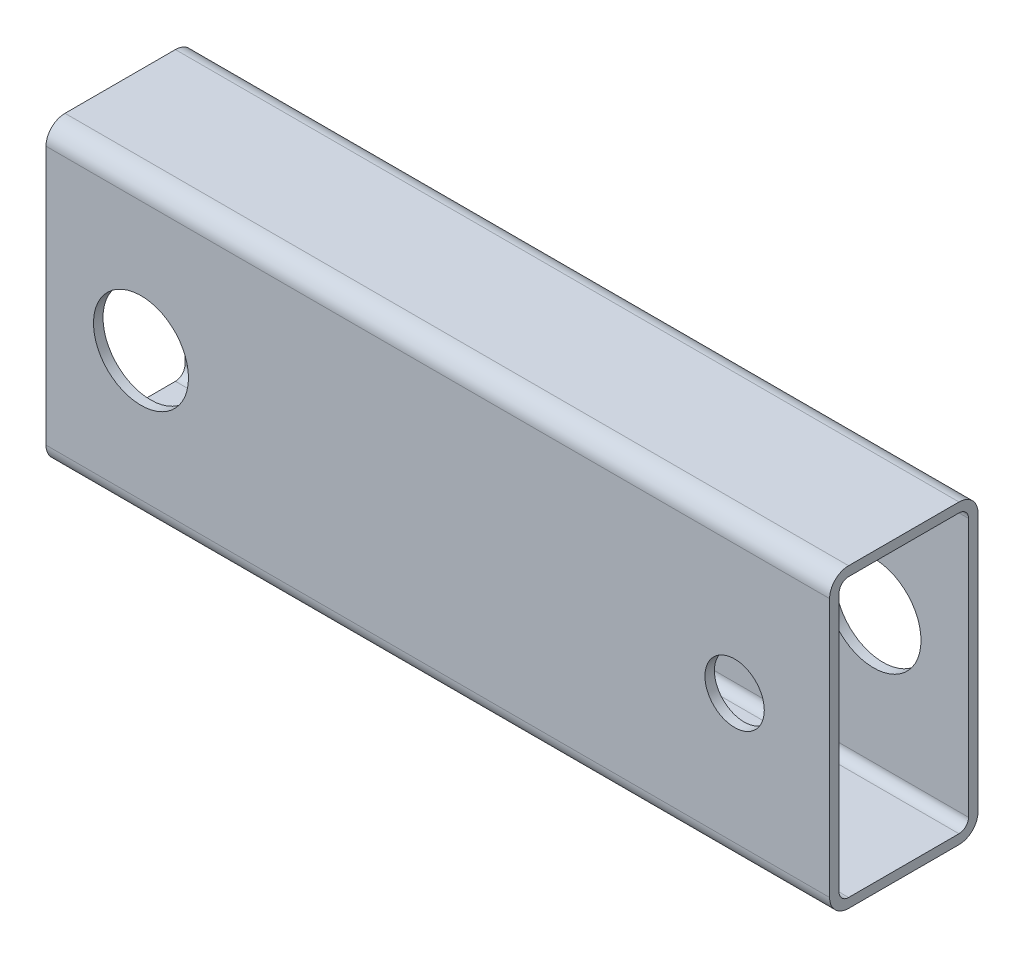
ISO-10303-21;
HEADER;
FILE_DESCRIPTION(('STEP AP214'),'2;1');
FILE_NAME('part.step','',(''),(''),'','','');
FILE_SCHEMA(('AUTOMOTIVE_DESIGN { 1 0 10303 214 1 1 1 1 }'));
ENDSEC;
DATA;
#1=APPLICATION_CONTEXT('core data for automotive mechanical design processes');
#2=APPLICATION_PROTOCOL_DEFINITION('international standard','automotive_design',2000,#1);
#3=PRODUCT_CONTEXT('',#1,'mechanical');
#4=PRODUCT('Part','Part','',(#3));
#5=PRODUCT_RELATED_PRODUCT_CATEGORY('part','',(#4));
#6=PRODUCT_DEFINITION_FORMATION('','',#4);
#7=PRODUCT_DEFINITION_CONTEXT('part definition',#1,'design');
#8=PRODUCT_DEFINITION('design','',#6,#7);
#9=PRODUCT_DEFINITION_SHAPE('','',#8);
#10=(LENGTH_UNIT() NAMED_UNIT(*) SI_UNIT(.MILLI.,.METRE.));
#11=(NAMED_UNIT(*) PLANE_ANGLE_UNIT() SI_UNIT($,.RADIAN.));
#12=(NAMED_UNIT(*) SI_UNIT($,.STERADIAN.) SOLID_ANGLE_UNIT());
#13=UNCERTAINTY_MEASURE_WITH_UNIT(LENGTH_MEASURE(1.E-05),#10,'distance_accuracy_value','');
#14=(GEOMETRIC_REPRESENTATION_CONTEXT(3) GLOBAL_UNCERTAINTY_ASSIGNED_CONTEXT((#13)) GLOBAL_UNIT_ASSIGNED_CONTEXT((#10,
#11,#12)) REPRESENTATION_CONTEXT('',''));
#15=CARTESIAN_POINT('',(0.,0.,0.));
#16=DIRECTION('',(0.,0.,1.));
#17=DIRECTION('',(1.,0.,0.));
#18=AXIS2_PLACEMENT_3D('',#15,#16,#17);
#19=CARTESIAN_POINT('',(132.,-21.8,12.5));
#20=DIRECTION('',(0.,0.,-1.));
#21=DIRECTION('',(-1.,0.,0.));
#22=AXIS2_PLACEMENT_3D('',#19,#20,#21);
#23=PLANE('',#22);
#24=CARTESIAN_POINT('',(16.,0.,12.5));
#25=DIRECTION('',(0.,0.,1.));
#26=DIRECTION('',(1.,0.,0.));
#27=AXIS2_PLACEMENT_3D('',#24,#25,#26);
#28=CIRCLE('',#27,8.);
#29=CARTESIAN_POINT('',(24.,0.,12.5));
#30=VERTEX_POINT('',#29);
#31=EDGE_CURVE('E602',#30,#30,#28,.T.);
#32=ORIENTED_EDGE('',*,*,#31,.F.);
#33=EDGE_LOOP('',(#32));
#34=FACE_BOUND('',#33,.T.);
#35=DIRECTION('',(0.,-1.,0.));
#36=VECTOR('',#35,1.);
#37=CARTESIAN_POINT('',(0.,-21.8,12.5));
#38=LINE('',#37,#36);
#39=CARTESIAN_POINT('',(0.,21.8,12.5));
#40=VERTEX_POINT('',#39);
#41=CARTESIAN_POINT('',(0.,-21.8,12.5));
#42=VERTEX_POINT('',#41);
#43=EDGE_CURVE('E247',#40,#42,#38,.T.);
#44=ORIENTED_EDGE('',*,*,#43,.T.);
#45=DIRECTION('',(-1.,0.,0.));
#46=VECTOR('',#45,1.);
#47=CARTESIAN_POINT('',(132.,-21.8,12.5));
#48=LINE('',#47,#46);
#49=CARTESIAN_POINT('',(132.,-21.8,12.5));
#50=VERTEX_POINT('',#49);
#51=EDGE_CURVE('E259',#50,#42,#48,.T.);
#52=ORIENTED_EDGE('',*,*,#51,.F.);
#53=DIRECTION('',(0.,-1.,0.));
#54=VECTOR('',#53,1.);
#55=CARTESIAN_POINT('',(132.,-21.8,12.5));
#56=LINE('',#55,#54);
#57=CARTESIAN_POINT('',(132.,21.8,12.5));
#58=VERTEX_POINT('',#57);
#59=EDGE_CURVE('E325',#58,#50,#56,.T.);
#60=ORIENTED_EDGE('',*,*,#59,.F.);
#61=DIRECTION('',(-1.,0.,0.));
#62=VECTOR('',#61,1.);
#63=CARTESIAN_POINT('',(132.,21.8,12.5));
#64=LINE('',#63,#62);
#65=EDGE_CURVE('E262',#58,#40,#64,.T.);
#66=ORIENTED_EDGE('',*,*,#65,.T.);
#67=EDGE_LOOP('',(#44,#52,#60,#66));
#68=FACE_BOUND('',#67,.T.);
#69=CARTESIAN_POINT('',(116.,0.,12.5));
#70=DIRECTION('',(0.,0.,1.));
#71=DIRECTION('',(1.,0.,0.));
#72=AXIS2_PLACEMENT_3D('',#69,#70,#71);
#73=CIRCLE('',#72,5.);
#74=CARTESIAN_POINT('',(121.,0.,12.5));
#75=VERTEX_POINT('',#74);
#76=EDGE_CURVE('E353',#75,#75,#73,.F.);
#77=ORIENTED_EDGE('',*,*,#76,.T.);
#78=EDGE_LOOP('',(#77));
#79=FACE_BOUND('',#78,.T.);
#80=ADVANCED_FACE('F67',(#34,#68,#79),#23,.F.);
#81=CARTESIAN_POINT('',(132.,21.8,-10.9));
#82=DIRECTION('',(0.,0.,1.));
#83=DIRECTION('',(1.,0.,0.));
#84=AXIS2_PLACEMENT_3D('',#81,#82,#83);
#85=PLANE('',#84);
#86=CARTESIAN_POINT('',(116.,0.,-10.9));
#87=DIRECTION('',(0.,0.,1.));
#88=DIRECTION('',(1.,0.,0.));
#89=AXIS2_PLACEMENT_3D('',#86,#87,#88);
#90=CIRCLE('',#89,8.);
#91=CARTESIAN_POINT('',(124.,0.,-10.9));
#92=VERTEX_POINT('',#91);
#93=EDGE_CURVE('E600',#92,#92,#90,.T.);
#94=ORIENTED_EDGE('',*,*,#93,.F.);
#95=EDGE_LOOP('',(#94));
#96=FACE_BOUND('',#95,.T.);
#97=DIRECTION('',(0.,1.,0.));
#98=VECTOR('',#97,1.);
#99=CARTESIAN_POINT('',(0.,21.8,-10.9));
#100=LINE('',#99,#98);
#101=CARTESIAN_POINT('',(0.,-21.8,-10.9));
#102=VERTEX_POINT('',#101);
#103=CARTESIAN_POINT('',(0.,21.8,-10.9));
#104=VERTEX_POINT('',#103);
#105=EDGE_CURVE('E225',#102,#104,#100,.T.);
#106=ORIENTED_EDGE('',*,*,#105,.F.);
#107=DIRECTION('',(-1.,0.,0.));
#108=VECTOR('',#107,1.);
#109=CARTESIAN_POINT('',(132.,-21.8,-10.9));
#110=LINE('',#109,#108);
#111=CARTESIAN_POINT('',(132.,-21.8,-10.9));
#112=VERTEX_POINT('',#111);
#113=EDGE_CURVE('E274',#112,#102,#110,.T.);
#114=ORIENTED_EDGE('',*,*,#113,.F.);
#115=DIRECTION('',(0.,1.,0.));
#116=VECTOR('',#115,1.);
#117=CARTESIAN_POINT('',(132.,21.8,-10.9));
#118=LINE('',#117,#116);
#119=CARTESIAN_POINT('',(132.,21.8,-10.9));
#120=VERTEX_POINT('',#119);
#121=EDGE_CURVE('E300',#112,#120,#118,.T.);
#122=ORIENTED_EDGE('',*,*,#121,.T.);
#123=DIRECTION('',(-1.,0.,0.));
#124=VECTOR('',#123,1.);
#125=CARTESIAN_POINT('',(132.,21.8,-10.9));
#126=LINE('',#125,#124);
#127=EDGE_CURVE('E276',#120,#104,#126,.T.);
#128=ORIENTED_EDGE('',*,*,#127,.T.);
#129=EDGE_LOOP('',(#106,#114,#122,#128));
#130=FACE_BOUND('',#129,.T.);
#131=CARTESIAN_POINT('',(16.,0.,-10.9));
#132=DIRECTION('',(0.,0.,1.));
#133=DIRECTION('',(1.,0.,0.));
#134=AXIS2_PLACEMENT_3D('',#131,#132,#133);
#135=CIRCLE('',#134,5.);
#136=CARTESIAN_POINT('',(21.,0.,-10.9));
#137=VERTEX_POINT('',#136);
#138=EDGE_CURVE('E219',#137,#137,#135,.T.);
#139=ORIENTED_EDGE('',*,*,#138,.F.);
#140=EDGE_LOOP('',(#139));
#141=FACE_BOUND('',#140,.T.);
#142=ADVANCED_FACE('F303',(#96,#130,#141),#85,.T.);
#143=CARTESIAN_POINT('',(132.,-21.8,10.9));
#144=DIRECTION('',(0.,0.,-1.));
#145=DIRECTION('',(-1.,0.,0.));
#146=AXIS2_PLACEMENT_3D('',#143,#144,#145);
#147=PLANE('',#146);
#148=CARTESIAN_POINT('',(16.,0.,10.9));
#149=DIRECTION('',(0.,0.,-1.));
#150=DIRECTION('',(-1.,0.,0.));
#151=AXIS2_PLACEMENT_3D('',#148,#149,#150);
#152=CIRCLE('',#151,8.);
#153=CARTESIAN_POINT('',(8.,0.,10.9));
#154=VERTEX_POINT('',#153);
#155=EDGE_CURVE('E358',#154,#154,#152,.F.);
#156=ORIENTED_EDGE('',*,*,#155,.T.);
#157=EDGE_LOOP('',(#156));
#158=FACE_BOUND('',#157,.T.);
#159=CARTESIAN_POINT('',(116.,0.,10.9));
#160=DIRECTION('',(0.,0.,-1.));
#161=DIRECTION('',(-1.,0.,0.));
#162=AXIS2_PLACEMENT_3D('',#159,#160,#161);
#163=CIRCLE('',#162,5.);
#164=CARTESIAN_POINT('',(111.,0.,10.9));
#165=VERTEX_POINT('',#164);
#166=EDGE_CURVE('E352',#165,#165,#163,.F.);
#167=ORIENTED_EDGE('',*,*,#166,.T.);
#168=EDGE_LOOP('',(#167));
#169=FACE_BOUND('',#168,.T.);
#170=DIRECTION('',(0.,-1.,0.));
#171=VECTOR('',#170,1.);
#172=CARTESIAN_POINT('',(0.,-21.8,10.9));
#173=LINE('',#172,#171);
#174=CARTESIAN_POINT('',(0.,21.8,10.9));
#175=VERTEX_POINT('',#174);
#176=CARTESIAN_POINT('',(0.,-21.8,10.9));
#177=VERTEX_POINT('',#176);
#178=EDGE_CURVE('E237',#175,#177,#173,.T.);
#179=ORIENTED_EDGE('',*,*,#178,.F.);
#180=DIRECTION('',(-1.,0.,0.));
#181=VECTOR('',#180,1.);
#182=CARTESIAN_POINT('',(132.,21.8,10.9));
#183=LINE('',#182,#181);
#184=CARTESIAN_POINT('',(132.,21.8,10.9));
#185=VERTEX_POINT('',#184);
#186=EDGE_CURVE('E211',#185,#175,#183,.T.);
#187=ORIENTED_EDGE('',*,*,#186,.F.);
#188=DIRECTION('',(0.,-1.,0.));
#189=VECTOR('',#188,1.);
#190=CARTESIAN_POINT('',(132.,-21.8,10.9));
#191=LINE('',#190,#189);
#192=CARTESIAN_POINT('',(132.,-21.8,10.9));
#193=VERTEX_POINT('',#192);
#194=EDGE_CURVE('E316',#185,#193,#191,.T.);
#195=ORIENTED_EDGE('',*,*,#194,.T.);
#196=DIRECTION('',(-1.,0.,0.));
#197=VECTOR('',#196,1.);
#198=CARTESIAN_POINT('',(132.,-21.8,10.9));
#199=LINE('',#198,#197);
#200=EDGE_CURVE('E268',#193,#177,#199,.T.);
#201=ORIENTED_EDGE('',*,*,#200,.T.);
#202=EDGE_LOOP('',(#179,#187,#195,#201));
#203=FACE_BOUND('',#202,.T.);
#204=ADVANCED_FACE('F345',(#158,#169,#203),#147,.T.);
#205=CARTESIAN_POINT('',(132.,21.8,-12.5));
#206=DIRECTION('',(0.,0.,1.));
#207=DIRECTION('',(1.,0.,0.));
#208=AXIS2_PLACEMENT_3D('',#205,#206,#207);
#209=PLANE('',#208);
#210=CARTESIAN_POINT('',(116.,0.,-12.5));
#211=DIRECTION('',(0.,0.,1.));
#212=DIRECTION('',(1.,0.,0.));
#213=AXIS2_PLACEMENT_3D('',#210,#211,#212);
#214=CIRCLE('',#213,8.);
#215=CARTESIAN_POINT('',(124.,0.,-12.5));
#216=VERTEX_POINT('',#215);
#217=EDGE_CURVE('E597',#216,#216,#214,.F.);
#218=ORIENTED_EDGE('',*,*,#217,.F.);
#219=EDGE_LOOP('',(#218));
#220=FACE_BOUND('',#219,.T.);
#221=DIRECTION('',(0.,1.,0.));
#222=VECTOR('',#221,1.);
#223=CARTESIAN_POINT('',(0.,21.8,-12.5));
#224=LINE('',#223,#222);
#225=CARTESIAN_POINT('',(0.,-21.8,-12.5));
#226=VERTEX_POINT('',#225);
#227=CARTESIAN_POINT('',(0.,21.8,-12.5));
#228=VERTEX_POINT('',#227);
#229=EDGE_CURVE('E145',#226,#228,#224,.T.);
#230=ORIENTED_EDGE('',*,*,#229,.T.);
#231=DIRECTION('',(-1.,0.,0.));
#232=VECTOR('',#231,1.);
#233=CARTESIAN_POINT('',(132.,21.8,-12.5));
#234=LINE('',#233,#232);
#235=CARTESIAN_POINT('',(132.,21.8,-12.5));
#236=VERTEX_POINT('',#235);
#237=EDGE_CURVE('E255',#236,#228,#234,.T.);
#238=ORIENTED_EDGE('',*,*,#237,.F.);
#239=DIRECTION('',(0.,1.,0.));
#240=VECTOR('',#239,1.);
#241=CARTESIAN_POINT('',(132.,21.8,-12.5));
#242=LINE('',#241,#240);
#243=CARTESIAN_POINT('',(132.,-21.8,-12.5));
#244=VERTEX_POINT('',#243);
#245=EDGE_CURVE('E86',#244,#236,#242,.T.);
#246=ORIENTED_EDGE('',*,*,#245,.F.);
#247=DIRECTION('',(-1.,0.,0.));
#248=VECTOR('',#247,1.);
#249=CARTESIAN_POINT('',(132.,-21.8,-12.5));
#250=LINE('',#249,#248);
#251=EDGE_CURVE('E207',#244,#226,#250,.T.);
#252=ORIENTED_EDGE('',*,*,#251,.T.);
#253=EDGE_LOOP('',(#230,#238,#246,#252));
#254=FACE_BOUND('',#253,.T.);
#255=CARTESIAN_POINT('',(16.,0.,-12.5));
#256=DIRECTION('',(0.,0.,1.));
#257=DIRECTION('',(1.,0.,0.));
#258=AXIS2_PLACEMENT_3D('',#255,#256,#257);
#259=CIRCLE('',#258,5.);
#260=CARTESIAN_POINT('',(21.,0.,-12.5));
#261=VERTEX_POINT('',#260);
#262=EDGE_CURVE('E350',#261,#261,#259,.T.);
#263=ORIENTED_EDGE('',*,*,#262,.T.);
#264=EDGE_LOOP('',(#263));
#265=FACE_BOUND('',#264,.T.);
#266=ADVANCED_FACE('F342',(#220,#254,#265),#209,.F.);
#267=CARTESIAN_POINT('',(132.,21.8,-9.30000000000001));
#268=DIRECTION('',(-1.,0.,0.));
#269=DIRECTION('',(0.,0.,1.));
#270=AXIS2_PLACEMENT_3D('',#267,#268,#269);
#271=CYLINDRICAL_SURFACE('',#270,3.2);
#272=CARTESIAN_POINT('',(0.,21.8,-9.30000000000001));
#273=DIRECTION('',(1.,0.,0.));
#274=DIRECTION('',(0.,0.,-1.));
#275=AXIS2_PLACEMENT_3D('',#272,#273,#274);
#276=CIRCLE('',#275,3.2);
#277=CARTESIAN_POINT('',(0.,25.,-9.30000000000001));
#278=VERTEX_POINT('',#277);
#279=EDGE_CURVE('E240',#228,#278,#276,.T.);
#280=ORIENTED_EDGE('',*,*,#279,.T.);
#281=DIRECTION('',(-1.,0.,0.));
#282=VECTOR('',#281,1.);
#283=CARTESIAN_POINT('',(132.,25.,-9.30000000000001));
#284=LINE('',#283,#282);
#285=CARTESIAN_POINT('',(132.,25.,-9.30000000000001));
#286=VERTEX_POINT('',#285);
#287=EDGE_CURVE('E12',#286,#278,#284,.T.);
#288=ORIENTED_EDGE('',*,*,#287,.F.);
#289=CARTESIAN_POINT('',(132.,21.8,-9.30000000000001));
#290=DIRECTION('',(1.,0.,0.));
#291=DIRECTION('',(0.,0.,-1.));
#292=AXIS2_PLACEMENT_3D('',#289,#290,#291);
#293=CIRCLE('',#292,3.2);
#294=EDGE_CURVE('E319',#236,#286,#293,.T.);
#295=ORIENTED_EDGE('',*,*,#294,.F.);
#296=ORIENTED_EDGE('',*,*,#237,.T.);
#297=EDGE_LOOP('',(#280,#288,#295,#296));
#298=FACE_BOUND('',#297,.T.);
#299=ADVANCED_FACE('F340',(#298),#271,.T.);
#300=CARTESIAN_POINT('',(132.,25.,-9.30000000000001));
#301=DIRECTION('',(0.,-1.,0.));
#302=DIRECTION('',(0.,0.,-1.));
#303=AXIS2_PLACEMENT_3D('',#300,#301,#302);
#304=PLANE('',#303);
#305=DIRECTION('',(0.,0.,1.));
#306=VECTOR('',#305,1.);
#307=CARTESIAN_POINT('',(0.,25.,-9.30000000000001));
#308=LINE('',#307,#306);
#309=CARTESIAN_POINT('',(0.,25.,9.30000000000001));
#310=VERTEX_POINT('',#309);
#311=EDGE_CURVE('E243',#278,#310,#308,.T.);
#312=ORIENTED_EDGE('',*,*,#311,.T.);
#313=DIRECTION('',(-1.,0.,0.));
#314=VECTOR('',#313,1.);
#315=CARTESIAN_POINT('',(132.,25.,9.30000000000001));
#316=LINE('',#315,#314);
#317=CARTESIAN_POINT('',(132.,25.,9.30000000000001));
#318=VERTEX_POINT('',#317);
#319=EDGE_CURVE('E77',#318,#310,#316,.T.);
#320=ORIENTED_EDGE('',*,*,#319,.F.);
#321=DIRECTION('',(0.,0.,1.));
#322=VECTOR('',#321,1.);
#323=CARTESIAN_POINT('',(132.,25.,-9.30000000000001));
#324=LINE('',#323,#322);
#325=EDGE_CURVE('E321',#286,#318,#324,.T.);
#326=ORIENTED_EDGE('',*,*,#325,.F.);
#327=ORIENTED_EDGE('',*,*,#287,.T.);
#328=EDGE_LOOP('',(#312,#320,#326,#327));
#329=FACE_BOUND('',#328,.T.);
#330=ADVANCED_FACE('F403',(#329),#304,.F.);
#331=CARTESIAN_POINT('',(132.,21.8,9.30000000000001));
#332=DIRECTION('',(-1.,0.,0.));
#333=DIRECTION('',(0.,0.,1.));
#334=AXIS2_PLACEMENT_3D('',#331,#332,#333);
#335=CYLINDRICAL_SURFACE('',#334,3.2);
#336=CARTESIAN_POINT('',(0.,21.8,9.30000000000001));
#337=DIRECTION('',(1.,0.,0.));
#338=DIRECTION('',(0.,0.,-1.));
#339=AXIS2_PLACEMENT_3D('',#336,#337,#338);
#340=CIRCLE('',#339,3.2);
#341=EDGE_CURVE('E245',#310,#40,#340,.T.);
#342=ORIENTED_EDGE('',*,*,#341,.T.);
#343=ORIENTED_EDGE('',*,*,#65,.F.);
#344=CARTESIAN_POINT('',(132.,21.8,9.30000000000001));
#345=DIRECTION('',(1.,0.,0.));
#346=DIRECTION('',(0.,0.,-1.));
#347=AXIS2_PLACEMENT_3D('',#344,#345,#346);
#348=CIRCLE('',#347,3.2);
#349=EDGE_CURVE('E323',#318,#58,#348,.T.);
#350=ORIENTED_EDGE('',*,*,#349,.F.);
#351=ORIENTED_EDGE('',*,*,#319,.T.);
#352=EDGE_LOOP('',(#342,#343,#350,#351));
#353=FACE_BOUND('',#352,.T.);
#354=ADVANCED_FACE('F400',(#353),#335,.T.);
#355=CARTESIAN_POINT('',(132.,-21.8,9.30000000000001));
#356=DIRECTION('',(-1.,0.,0.));
#357=DIRECTION('',(0.,0.,1.));
#358=AXIS2_PLACEMENT_3D('',#355,#356,#357);
#359=CYLINDRICAL_SURFACE('',#358,3.2);
#360=CARTESIAN_POINT('',(0.,-21.8,9.30000000000001));
#361=DIRECTION('',(1.,0.,0.));
#362=DIRECTION('',(0.,0.,-1.));
#363=AXIS2_PLACEMENT_3D('',#360,#361,#362);
#364=CIRCLE('',#363,3.2);
#365=CARTESIAN_POINT('',(0.,-25.,9.30000000000001));
#366=VERTEX_POINT('',#365);
#367=EDGE_CURVE('E249',#42,#366,#364,.T.);
#368=ORIENTED_EDGE('',*,*,#367,.T.);
#369=DIRECTION('',(-1.,0.,0.));
#370=VECTOR('',#369,1.);
#371=CARTESIAN_POINT('',(132.,-25.,9.30000000000001));
#372=LINE('',#371,#370);
#373=CARTESIAN_POINT('',(132.,-25.,9.30000000000001));
#374=VERTEX_POINT('',#373);
#375=EDGE_CURVE('E206',#374,#366,#372,.T.);
#376=ORIENTED_EDGE('',*,*,#375,.F.);
#377=CARTESIAN_POINT('',(132.,-21.8,9.30000000000001));
#378=DIRECTION('',(1.,0.,0.));
#379=DIRECTION('',(0.,0.,-1.));
#380=AXIS2_PLACEMENT_3D('',#377,#378,#379);
#381=CIRCLE('',#380,3.2);
#382=EDGE_CURVE('E197',#50,#374,#381,.T.);
#383=ORIENTED_EDGE('',*,*,#382,.F.);
#384=ORIENTED_EDGE('',*,*,#51,.T.);
#385=EDGE_LOOP('',(#368,#376,#383,#384));
#386=FACE_BOUND('',#385,.T.);
#387=ADVANCED_FACE('F335',(#386),#359,.T.);
#388=CARTESIAN_POINT('',(132.,-25.,9.30000000000001));
#389=DIRECTION('',(0.,1.,0.));
#390=DIRECTION('',(0.,0.,1.));
#391=AXIS2_PLACEMENT_3D('',#388,#389,#390);
#392=PLANE('',#391);
#393=DIRECTION('',(0.,0.,-1.));
#394=VECTOR('',#393,1.);
#395=CARTESIAN_POINT('',(0.,-25.,9.30000000000001));
#396=LINE('',#395,#394);
#397=CARTESIAN_POINT('',(0.,-25.,-9.30000000000001));
#398=VERTEX_POINT('',#397);
#399=EDGE_CURVE('E205',#366,#398,#396,.T.);
#400=ORIENTED_EDGE('',*,*,#399,.T.);
#401=DIRECTION('',(-1.,0.,0.));
#402=VECTOR('',#401,1.);
#403=CARTESIAN_POINT('',(132.,-25.,-9.30000000000001));
#404=LINE('',#403,#402);
#405=CARTESIAN_POINT('',(132.,-25.,-9.30000000000001));
#406=VERTEX_POINT('',#405);
#407=EDGE_CURVE('E202',#406,#398,#404,.T.);
#408=ORIENTED_EDGE('',*,*,#407,.F.);
#409=DIRECTION('',(0.,0.,-1.));
#410=VECTOR('',#409,1.);
#411=CARTESIAN_POINT('',(132.,-25.,9.30000000000001));
#412=LINE('',#411,#410);
#413=EDGE_CURVE('E191',#374,#406,#412,.T.);
#414=ORIENTED_EDGE('',*,*,#413,.F.);
#415=ORIENTED_EDGE('',*,*,#375,.T.);
#416=EDGE_LOOP('',(#400,#408,#414,#415));
#417=FACE_BOUND('',#416,.T.);
#418=ADVANCED_FACE('F203',(#417),#392,.F.);
#419=CARTESIAN_POINT('',(132.,-21.8,-9.30000000000001));
#420=DIRECTION('',(-1.,0.,0.));
#421=DIRECTION('',(0.,0.,1.));
#422=AXIS2_PLACEMENT_3D('',#419,#420,#421);
#423=CYLINDRICAL_SURFACE('',#422,3.2);
#424=CARTESIAN_POINT('',(0.,-21.8,-9.30000000000001));
#425=DIRECTION('',(1.,0.,0.));
#426=DIRECTION('',(0.,0.,-1.));
#427=AXIS2_PLACEMENT_3D('',#424,#425,#426);
#428=CIRCLE('',#427,3.2);
#429=EDGE_CURVE('E139',#398,#226,#428,.T.);
#430=ORIENTED_EDGE('',*,*,#429,.T.);
#431=ORIENTED_EDGE('',*,*,#251,.F.);
#432=CARTESIAN_POINT('',(132.,-21.8,-9.30000000000001));
#433=DIRECTION('',(1.,0.,0.));
#434=DIRECTION('',(0.,0.,-1.));
#435=AXIS2_PLACEMENT_3D('',#432,#433,#434);
#436=CIRCLE('',#435,3.2);
#437=EDGE_CURVE('E195',#406,#244,#436,.T.);
#438=ORIENTED_EDGE('',*,*,#437,.F.);
#439=ORIENTED_EDGE('',*,*,#407,.T.);
#440=EDGE_LOOP('',(#430,#431,#438,#439));
#441=FACE_BOUND('',#440,.T.);
#442=ADVANCED_FACE('F209',(#441),#423,.T.);
#443=CARTESIAN_POINT('',(132.,21.8,9.30000000000001));
#444=DIRECTION('',(-1.,0.,0.));
#445=DIRECTION('',(0.,0.,1.));
#446=AXIS2_PLACEMENT_3D('',#443,#444,#445);
#447=CYLINDRICAL_SURFACE('',#446,1.6);
#448=CARTESIAN_POINT('',(0.,21.8,9.30000000000001));
#449=DIRECTION('',(1.,0.,0.));
#450=DIRECTION('',(0.,0.,-1.));
#451=AXIS2_PLACEMENT_3D('',#448,#449,#450);
#452=CIRCLE('',#451,1.6);
#453=CARTESIAN_POINT('',(0.,23.4,9.30000000000001));
#454=VERTEX_POINT('',#453);
#455=EDGE_CURVE('E215',#454,#175,#452,.T.);
#456=ORIENTED_EDGE('',*,*,#455,.F.);
#457=DIRECTION('',(-1.,0.,0.));
#458=VECTOR('',#457,1.);
#459=CARTESIAN_POINT('',(132.,23.4,9.30000000000001));
#460=LINE('',#459,#458);
#461=CARTESIAN_POINT('',(132.,23.4,9.30000000000001));
#462=VERTEX_POINT('',#461);
#463=EDGE_CURVE('E71',#462,#454,#460,.T.);
#464=ORIENTED_EDGE('',*,*,#463,.F.);
#465=CARTESIAN_POINT('',(132.,21.8,9.30000000000001));
#466=DIRECTION('',(1.,0.,0.));
#467=DIRECTION('',(0.,0.,-1.));
#468=AXIS2_PLACEMENT_3D('',#465,#466,#467);
#469=CIRCLE('',#468,1.6);
#470=EDGE_CURVE('E254',#462,#185,#469,.T.);
#471=ORIENTED_EDGE('',*,*,#470,.T.);
#472=ORIENTED_EDGE('',*,*,#186,.T.);
#473=EDGE_LOOP('',(#456,#464,#471,#472));
#474=FACE_BOUND('',#473,.T.);
#475=ADVANCED_FACE('F69',(#474),#447,.F.);
#476=CARTESIAN_POINT('',(132.,23.4,-9.30000000000001));
#477=DIRECTION('',(0.,-1.,0.));
#478=DIRECTION('',(0.,0.,-1.));
#479=AXIS2_PLACEMENT_3D('',#476,#477,#478);
#480=PLANE('',#479);
#481=DIRECTION('',(0.,0.,1.));
#482=VECTOR('',#481,1.);
#483=CARTESIAN_POINT('',(0.,23.4,-9.30000000000001));
#484=LINE('',#483,#482);
#485=CARTESIAN_POINT('',(0.,23.4,-9.30000000000001));
#486=VERTEX_POINT('',#485);
#487=EDGE_CURVE('E218',#486,#454,#484,.T.);
#488=ORIENTED_EDGE('',*,*,#487,.F.);
#489=DIRECTION('',(-1.,0.,0.));
#490=VECTOR('',#489,1.);
#491=CARTESIAN_POINT('',(132.,23.4,-9.30000000000001));
#492=LINE('',#491,#490);
#493=CARTESIAN_POINT('',(132.,23.4,-9.30000000000001));
#494=VERTEX_POINT('',#493);
#495=EDGE_CURVE('E277',#494,#486,#492,.T.);
#496=ORIENTED_EDGE('',*,*,#495,.F.);
#497=DIRECTION('',(0.,0.,1.));
#498=VECTOR('',#497,1.);
#499=CARTESIAN_POINT('',(132.,23.4,-9.30000000000001));
#500=LINE('',#499,#498);
#501=EDGE_CURVE('E286',#494,#462,#500,.T.);
#502=ORIENTED_EDGE('',*,*,#501,.T.);
#503=ORIENTED_EDGE('',*,*,#463,.T.);
#504=EDGE_LOOP('',(#488,#496,#502,#503));
#505=FACE_BOUND('',#504,.T.);
#506=ADVANCED_FACE('F284',(#505),#480,.T.);
#507=CARTESIAN_POINT('',(132.,21.8,-9.30000000000001));
#508=DIRECTION('',(-1.,0.,0.));
#509=DIRECTION('',(0.,0.,1.));
#510=AXIS2_PLACEMENT_3D('',#507,#508,#509);
#511=CYLINDRICAL_SURFACE('',#510,1.6);
#512=CARTESIAN_POINT('',(0.,21.8,-9.30000000000001));
#513=DIRECTION('',(1.,0.,0.));
#514=DIRECTION('',(0.,0.,-1.));
#515=AXIS2_PLACEMENT_3D('',#512,#513,#514);
#516=CIRCLE('',#515,1.6);
#517=EDGE_CURVE('E222',#104,#486,#516,.T.);
#518=ORIENTED_EDGE('',*,*,#517,.F.);
#519=ORIENTED_EDGE('',*,*,#127,.F.);
#520=CARTESIAN_POINT('',(132.,21.8,-9.30000000000001));
#521=DIRECTION('',(1.,0.,0.));
#522=DIRECTION('',(0.,0.,-1.));
#523=AXIS2_PLACEMENT_3D('',#520,#521,#522);
#524=CIRCLE('',#523,1.6);
#525=EDGE_CURVE('E294',#120,#494,#524,.T.);
#526=ORIENTED_EDGE('',*,*,#525,.T.);
#527=ORIENTED_EDGE('',*,*,#495,.T.);
#528=EDGE_LOOP('',(#518,#519,#526,#527));
#529=FACE_BOUND('',#528,.T.);
#530=ADVANCED_FACE('F292',(#529),#511,.F.);
#531=CARTESIAN_POINT('',(132.,-21.8,-9.30000000000001));
#532=DIRECTION('',(-1.,0.,0.));
#533=DIRECTION('',(0.,0.,1.));
#534=AXIS2_PLACEMENT_3D('',#531,#532,#533);
#535=CYLINDRICAL_SURFACE('',#534,1.6);
#536=CARTESIAN_POINT('',(0.,-21.8,-9.30000000000001));
#537=DIRECTION('',(1.,0.,0.));
#538=DIRECTION('',(0.,0.,-1.));
#539=AXIS2_PLACEMENT_3D('',#536,#537,#538);
#540=CIRCLE('',#539,1.6);
#541=CARTESIAN_POINT('',(0.,-23.4,-9.30000000000001));
#542=VERTEX_POINT('',#541);
#543=EDGE_CURVE('E228',#542,#102,#540,.T.);
#544=ORIENTED_EDGE('',*,*,#543,.F.);
#545=DIRECTION('',(-1.,0.,0.));
#546=VECTOR('',#545,1.);
#547=CARTESIAN_POINT('',(132.,-23.4,-9.30000000000001));
#548=LINE('',#547,#546);
#549=CARTESIAN_POINT('',(132.,-23.4,-9.30000000000001));
#550=VERTEX_POINT('',#549);
#551=EDGE_CURVE('E272',#550,#542,#548,.T.);
#552=ORIENTED_EDGE('',*,*,#551,.F.);
#553=CARTESIAN_POINT('',(132.,-21.8,-9.30000000000001));
#554=DIRECTION('',(1.,0.,0.));
#555=DIRECTION('',(0.,0.,-1.));
#556=AXIS2_PLACEMENT_3D('',#553,#554,#555);
#557=CIRCLE('',#556,1.6);
#558=EDGE_CURVE('E305',#550,#112,#557,.T.);
#559=ORIENTED_EDGE('',*,*,#558,.T.);
#560=ORIENTED_EDGE('',*,*,#113,.T.);
#561=EDGE_LOOP('',(#544,#552,#559,#560));
#562=FACE_BOUND('',#561,.T.);
#563=ADVANCED_FACE('F377',(#562),#535,.F.);
#564=CARTESIAN_POINT('',(132.,-23.4,9.30000000000001));
#565=DIRECTION('',(0.,1.,0.));
#566=DIRECTION('',(0.,0.,1.));
#567=AXIS2_PLACEMENT_3D('',#564,#565,#566);
#568=PLANE('',#567);
#569=DIRECTION('',(0.,0.,-1.));
#570=VECTOR('',#569,1.);
#571=CARTESIAN_POINT('',(0.,-23.4,9.30000000000001));
#572=LINE('',#571,#570);
#573=CARTESIAN_POINT('',(0.,-23.4,9.30000000000001));
#574=VERTEX_POINT('',#573);
#575=EDGE_CURVE('E231',#574,#542,#572,.T.);
#576=ORIENTED_EDGE('',*,*,#575,.F.);
#577=DIRECTION('',(-1.,0.,0.));
#578=VECTOR('',#577,1.);
#579=CARTESIAN_POINT('',(132.,-23.4,9.30000000000001));
#580=LINE('',#579,#578);
#581=CARTESIAN_POINT('',(132.,-23.4,9.30000000000001));
#582=VERTEX_POINT('',#581);
#583=EDGE_CURVE('E270',#582,#574,#580,.T.);
#584=ORIENTED_EDGE('',*,*,#583,.F.);
#585=DIRECTION('',(0.,0.,-1.));
#586=VECTOR('',#585,1.);
#587=CARTESIAN_POINT('',(132.,-23.4,9.30000000000001));
#588=LINE('',#587,#586);
#589=EDGE_CURVE('E307',#582,#550,#588,.T.);
#590=ORIENTED_EDGE('',*,*,#589,.T.);
#591=ORIENTED_EDGE('',*,*,#551,.T.);
#592=EDGE_LOOP('',(#576,#584,#590,#591));
#593=FACE_BOUND('',#592,.T.);
#594=ADVANCED_FACE('F374',(#593),#568,.T.);
#595=CARTESIAN_POINT('',(132.,-21.8,9.30000000000001));
#596=DIRECTION('',(-1.,0.,0.));
#597=DIRECTION('',(0.,0.,1.));
#598=AXIS2_PLACEMENT_3D('',#595,#596,#597);
#599=CYLINDRICAL_SURFACE('',#598,1.6);
#600=CARTESIAN_POINT('',(0.,-21.8,9.30000000000001));
#601=DIRECTION('',(1.,0.,0.));
#602=DIRECTION('',(0.,0.,-1.));
#603=AXIS2_PLACEMENT_3D('',#600,#601,#602);
#604=CIRCLE('',#603,1.6);
#605=EDGE_CURVE('E234',#177,#574,#604,.T.);
#606=ORIENTED_EDGE('',*,*,#605,.F.);
#607=ORIENTED_EDGE('',*,*,#200,.F.);
#608=CARTESIAN_POINT('',(132.,-21.8,9.30000000000001));
#609=DIRECTION('',(1.,0.,0.));
#610=DIRECTION('',(0.,0.,-1.));
#611=AXIS2_PLACEMENT_3D('',#608,#609,#610);
#612=CIRCLE('',#611,1.6);
#613=EDGE_CURVE('E313',#193,#582,#612,.T.);
#614=ORIENTED_EDGE('',*,*,#613,.T.);
#615=ORIENTED_EDGE('',*,*,#583,.T.);
#616=EDGE_LOOP('',(#606,#607,#614,#615));
#617=FACE_BOUND('',#616,.T.);
#618=ADVANCED_FACE('F372',(#617),#599,.F.);
#619=CARTESIAN_POINT('',(132.,21.8,-9.30000000000001));
#620=DIRECTION('',(1.,0.,0.));
#621=DIRECTION('',(0.,0.,-1.));
#622=AXIS2_PLACEMENT_3D('',#619,#620,#621);
#623=PLANE('',#622);
#624=ORIENTED_EDGE('',*,*,#470,.F.);
#625=ORIENTED_EDGE('',*,*,#501,.F.);
#626=ORIENTED_EDGE('',*,*,#525,.F.);
#627=ORIENTED_EDGE('',*,*,#121,.F.);
#628=ORIENTED_EDGE('',*,*,#558,.F.);
#629=ORIENTED_EDGE('',*,*,#589,.F.);
#630=ORIENTED_EDGE('',*,*,#613,.F.);
#631=ORIENTED_EDGE('',*,*,#194,.F.);
#632=EDGE_LOOP('',(#624,#625,#626,#627,#628,#629,#630,#631));
#633=FACE_BOUND('',#632,.T.);
#634=ORIENTED_EDGE('',*,*,#294,.T.);
#635=ORIENTED_EDGE('',*,*,#325,.T.);
#636=ORIENTED_EDGE('',*,*,#349,.T.);
#637=ORIENTED_EDGE('',*,*,#59,.T.);
#638=ORIENTED_EDGE('',*,*,#382,.T.);
#639=ORIENTED_EDGE('',*,*,#413,.T.);
#640=ORIENTED_EDGE('',*,*,#437,.T.);
#641=ORIENTED_EDGE('',*,*,#245,.T.);
#642=EDGE_LOOP('',(#634,#635,#636,#637,#638,#639,#640,#641));
#643=FACE_BOUND('',#642,.T.);
#644=ADVANCED_FACE('F193',(#633,#643),#623,.T.);
#645=CARTESIAN_POINT('',(0.,21.8,-9.30000000000001));
#646=DIRECTION('',(1.,0.,0.));
#647=DIRECTION('',(0.,0.,-1.));
#648=AXIS2_PLACEMENT_3D('',#645,#646,#647);
#649=PLANE('',#648);
#650=ORIENTED_EDGE('',*,*,#455,.T.);
#651=ORIENTED_EDGE('',*,*,#178,.T.);
#652=ORIENTED_EDGE('',*,*,#605,.T.);
#653=ORIENTED_EDGE('',*,*,#575,.T.);
#654=ORIENTED_EDGE('',*,*,#543,.T.);
#655=ORIENTED_EDGE('',*,*,#105,.T.);
#656=ORIENTED_EDGE('',*,*,#517,.T.);
#657=ORIENTED_EDGE('',*,*,#487,.T.);
#658=EDGE_LOOP('',(#650,#651,#652,#653,#654,#655,#656,#657));
#659=FACE_BOUND('',#658,.T.);
#660=ORIENTED_EDGE('',*,*,#279,.F.);
#661=ORIENTED_EDGE('',*,*,#229,.F.);
#662=ORIENTED_EDGE('',*,*,#429,.F.);
#663=ORIENTED_EDGE('',*,*,#399,.F.);
#664=ORIENTED_EDGE('',*,*,#367,.F.);
#665=ORIENTED_EDGE('',*,*,#43,.F.);
#666=ORIENTED_EDGE('',*,*,#341,.F.);
#667=ORIENTED_EDGE('',*,*,#311,.F.);
#668=EDGE_LOOP('',(#660,#661,#662,#663,#664,#665,#666,#667));
#669=FACE_BOUND('',#668,.T.);
#670=ADVANCED_FACE('F289',(#659,#669),#649,.F.);
#671=CARTESIAN_POINT('',(16.,0.,-12.5));
#672=DIRECTION('',(0.,0.,1.));
#673=DIRECTION('',(1.,0.,0.));
#674=AXIS2_PLACEMENT_3D('',#671,#672,#673);
#675=CYLINDRICAL_SURFACE('',#674,5.);
#676=ORIENTED_EDGE('',*,*,#138,.T.);
#677=EDGE_LOOP('',(#676));
#678=FACE_BOUND('',#677,.T.);
#679=ORIENTED_EDGE('',*,*,#262,.F.);
#680=EDGE_LOOP('',(#679));
#681=FACE_BOUND('',#680,.T.);
#682=ADVANCED_FACE('F420',(#678,#681),#675,.F.);
#683=CARTESIAN_POINT('',(116.,0.,-12.5));
#684=DIRECTION('',(0.,0.,1.));
#685=DIRECTION('',(1.,0.,0.));
#686=AXIS2_PLACEMENT_3D('',#683,#684,#685);
#687=CYLINDRICAL_SURFACE('',#686,5.);
#688=ORIENTED_EDGE('',*,*,#166,.F.);
#689=EDGE_LOOP('',(#688));
#690=FACE_BOUND('',#689,.T.);
#691=ORIENTED_EDGE('',*,*,#76,.F.);
#692=EDGE_LOOP('',(#691));
#693=FACE_BOUND('',#692,.T.);
#694=ADVANCED_FACE('F423',(#690,#693),#687,.F.);
#695=CARTESIAN_POINT('',(16.,0.,-11.7274169979695));
#696=DIRECTION('',(0.,0.,1.));
#697=DIRECTION('',(1.,0.,0.));
#698=AXIS2_PLACEMENT_3D('',#695,#696,#697);
#699=CYLINDRICAL_SURFACE('',#698,8.);
#700=ORIENTED_EDGE('',*,*,#31,.T.);
#701=EDGE_LOOP('',(#700));
#702=FACE_BOUND('',#701,.T.);
#703=ORIENTED_EDGE('',*,*,#155,.F.);
#704=EDGE_LOOP('',(#703));
#705=FACE_BOUND('',#704,.T.);
#706=ADVANCED_FACE('F569',(#702,#705),#699,.F.);
#707=CARTESIAN_POINT('',(116.,0.,-35.1274169979695));
#708=DIRECTION('',(0.,0.,1.));
#709=DIRECTION('',(1.,0.,0.));
#710=AXIS2_PLACEMENT_3D('',#707,#708,#709);
#711=CYLINDRICAL_SURFACE('',#710,8.);
#712=ORIENTED_EDGE('',*,*,#217,.T.);
#713=EDGE_LOOP('',(#712));
#714=FACE_BOUND('',#713,.T.);
#715=ORIENTED_EDGE('',*,*,#93,.T.);
#716=EDGE_LOOP('',(#715));
#717=FACE_BOUND('',#716,.T.);
#718=ADVANCED_FACE('F577',(#714,#717),#711,.F.);
#719=CLOSED_SHELL('',(#80,#142,#204,#266,#299,#330,#354,#387,#418,#442,#475,#506,#530,#563,#594,
#618,#644,#670,#682,#694,#706,#718));
#720=MANIFOLD_SOLID_BREP('B2',#719);
#721=ADVANCED_BREP_SHAPE_REPRESENTATION('',(#18,#720),#14);
#722=SHAPE_DEFINITION_REPRESENTATION(#9,#721);
ENDSEC;
END-ISO-10303-21;
